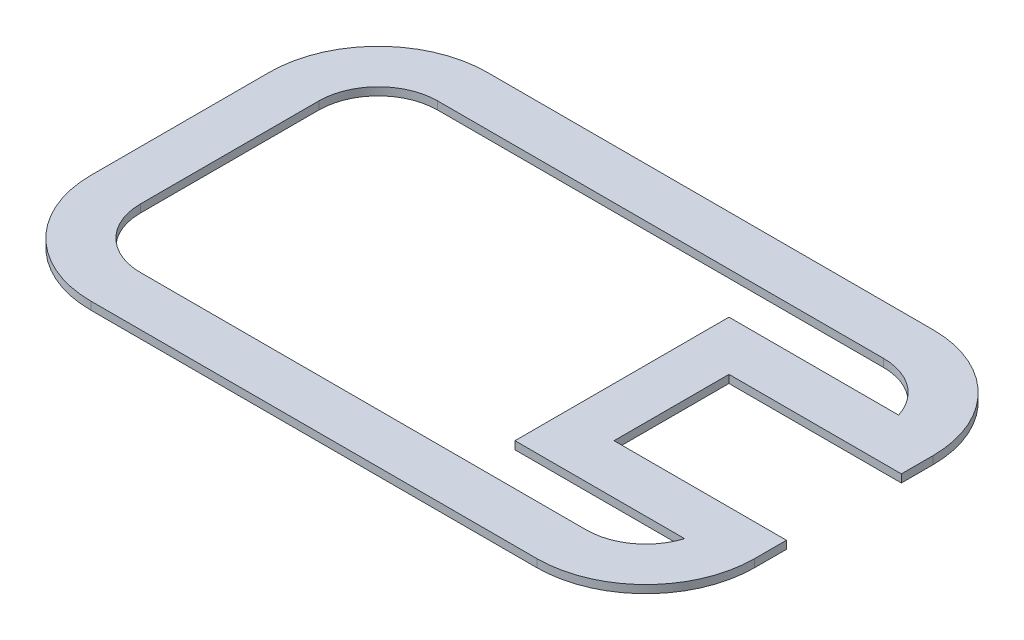
ISO-10303-21;
HEADER;
FILE_DESCRIPTION(('STEP AP214'),'2;1');
FILE_NAME('part.step','',(''),(''),'','','');
FILE_SCHEMA(('AUTOMOTIVE_DESIGN { 1 0 10303 214 1 1 1 1 }'));
ENDSEC;
DATA;
#1=APPLICATION_CONTEXT('core data for automotive mechanical design processes');
#2=APPLICATION_PROTOCOL_DEFINITION('international standard','automotive_design',2000,#1);
#3=PRODUCT_CONTEXT('',#1,'mechanical');
#4=PRODUCT('Part','Part','',(#3));
#5=PRODUCT_RELATED_PRODUCT_CATEGORY('part','',(#4));
#6=PRODUCT_DEFINITION_FORMATION('','',#4);
#7=PRODUCT_DEFINITION_CONTEXT('part definition',#1,'design');
#8=PRODUCT_DEFINITION('design','',#6,#7);
#9=PRODUCT_DEFINITION_SHAPE('','',#8);
#10=(LENGTH_UNIT() NAMED_UNIT(*) SI_UNIT(.MILLI.,.METRE.));
#11=(NAMED_UNIT(*) PLANE_ANGLE_UNIT() SI_UNIT($,.RADIAN.));
#12=(NAMED_UNIT(*) SI_UNIT($,.STERADIAN.) SOLID_ANGLE_UNIT());
#13=UNCERTAINTY_MEASURE_WITH_UNIT(LENGTH_MEASURE(1.E-05),#10,'distance_accuracy_value','');
#14=(GEOMETRIC_REPRESENTATION_CONTEXT(3) GLOBAL_UNCERTAINTY_ASSIGNED_CONTEXT((#13)) GLOBAL_UNIT_ASSIGNED_CONTEXT((#10,
#11,#12)) REPRESENTATION_CONTEXT('',''));
#15=CARTESIAN_POINT('',(0.,0.,0.));
#16=DIRECTION('',(0.,0.,1.));
#17=DIRECTION('',(1.,0.,0.));
#18=AXIS2_PLACEMENT_3D('',#15,#16,#17);
#19=CARTESIAN_POINT('',(55.,4.,-55.));
#20=DIRECTION('',(0.,-1.,0.));
#21=DIRECTION('',(0.,0.,-1.));
#22=AXIS2_PLACEMENT_3D('',#19,#20,#21);
#23=PLANE('',#22);
#24=CARTESIAN_POINT('',(55.,4.,-55.));
#25=DIRECTION('',(0.,1.,0.));
#26=DIRECTION('',(0.,0.,-1.));
#27=AXIS2_PLACEMENT_3D('',#24,#25,#26);
#28=CIRCLE('',#27,55.);
#29=CARTESIAN_POINT('',(0.,4.,-55.0000000000004));
#30=VERTEX_POINT('',#29);
#31=CARTESIAN_POINT('',(55.0000000000004,4.,0.));
#32=VERTEX_POINT('',#31);
#33=EDGE_CURVE('E262',#30,#32,#28,.T.);
#34=ORIENTED_EDGE('',*,*,#33,.T.);
#35=DIRECTION('',(1.,0.,0.));
#36=VECTOR('',#35,1.);
#37=CARTESIAN_POINT('',(55.0000000000004,4.,0.));
#38=LINE('',#37,#36);
#39=CARTESIAN_POINT('',(280.,4.,0.));
#40=VERTEX_POINT('',#39);
#41=EDGE_CURVE('E265',#32,#40,#38,.T.);
#42=ORIENTED_EDGE('',*,*,#41,.T.);
#43=CARTESIAN_POINT('',(280.,4.,-55.));
#44=DIRECTION('',(0.,1.,0.));
#45=DIRECTION('',(0.,0.,1.));
#46=AXIS2_PLACEMENT_3D('',#43,#44,#45);
#47=CIRCLE('',#46,55.);
#48=CARTESIAN_POINT('',(335.,4.,-55.0000000000004));
#49=VERTEX_POINT('',#48);
#50=EDGE_CURVE('E268',#40,#49,#47,.T.);
#51=ORIENTED_EDGE('',*,*,#50,.T.);
#52=DIRECTION('',(0.,0.,-1.));
#53=VECTOR('',#52,1.);
#54=CARTESIAN_POINT('',(335.,4.,-55.0000000000004));
#55=LINE('',#54,#53);
#56=CARTESIAN_POINT('',(335.,4.,-71.));
#57=VERTEX_POINT('',#56);
#58=EDGE_CURVE('E270',#49,#57,#55,.T.);
#59=ORIENTED_EDGE('',*,*,#58,.T.);
#60=DIRECTION('',(-1.,0.,0.));
#61=VECTOR('',#60,1.);
#62=CARTESIAN_POINT('',(248.,4.,-70.9999999999996));
#63=LINE('',#62,#61);
#64=CARTESIAN_POINT('',(248.,4.,-70.9999999999996));
#65=VERTEX_POINT('',#64);
#66=EDGE_CURVE('E272',#57,#65,#63,.T.);
#67=ORIENTED_EDGE('',*,*,#66,.T.);
#68=DIRECTION('',(0.,0.,-1.));
#69=VECTOR('',#68,1.);
#70=CARTESIAN_POINT('',(248.,4.,-129.));
#71=LINE('',#70,#69);
#72=CARTESIAN_POINT('',(248.,4.,-129.));
#73=VERTEX_POINT('',#72);
#74=EDGE_CURVE('E274',#65,#73,#71,.T.);
#75=ORIENTED_EDGE('',*,*,#74,.T.);
#76=DIRECTION('',(1.,0.,0.));
#77=VECTOR('',#76,1.);
#78=CARTESIAN_POINT('',(335.,4.,-129.));
#79=LINE('',#78,#77);
#80=CARTESIAN_POINT('',(335.,4.,-129.));
#81=VERTEX_POINT('',#80);
#82=EDGE_CURVE('E276',#73,#81,#79,.T.);
#83=ORIENTED_EDGE('',*,*,#82,.T.);
#84=DIRECTION('',(0.,0.,-1.));
#85=VECTOR('',#84,1.);
#86=CARTESIAN_POINT('',(335.,4.,-145.));
#87=LINE('',#86,#85);
#88=CARTESIAN_POINT('',(335.,4.,-145.));
#89=VERTEX_POINT('',#88);
#90=EDGE_CURVE('E278',#81,#89,#87,.T.);
#91=ORIENTED_EDGE('',*,*,#90,.T.);
#92=CARTESIAN_POINT('',(280.,4.,-145.));
#93=DIRECTION('',(0.,1.,0.));
#94=DIRECTION('',(0.,0.,-1.));
#95=AXIS2_PLACEMENT_3D('',#92,#93,#94);
#96=CIRCLE('',#95,55.);
#97=CARTESIAN_POINT('',(280.,4.,-200.));
#98=VERTEX_POINT('',#97);
#99=EDGE_CURVE('E280',#89,#98,#96,.T.);
#100=ORIENTED_EDGE('',*,*,#99,.T.);
#101=DIRECTION('',(-1.,0.,0.));
#102=VECTOR('',#101,1.);
#103=CARTESIAN_POINT('',(55.0000000000004,4.,-200.));
#104=LINE('',#103,#102);
#105=CARTESIAN_POINT('',(55.0000000000004,4.,-200.));
#106=VERTEX_POINT('',#105);
#107=EDGE_CURVE('E282',#98,#106,#104,.T.);
#108=ORIENTED_EDGE('',*,*,#107,.T.);
#109=CARTESIAN_POINT('',(55.,4.,-145.));
#110=DIRECTION('',(0.,1.,0.));
#111=DIRECTION('',(0.,0.,-1.));
#112=AXIS2_PLACEMENT_3D('',#109,#110,#111);
#113=CIRCLE('',#112,55.);
#114=CARTESIAN_POINT('',(0.,4.,-145.));
#115=VERTEX_POINT('',#114);
#116=EDGE_CURVE('E284',#106,#115,#113,.T.);
#117=ORIENTED_EDGE('',*,*,#116,.T.);
#118=DIRECTION('',(0.,0.,1.));
#119=VECTOR('',#118,1.);
#120=CARTESIAN_POINT('',(0.,4.,-55.0000000000004));
#121=LINE('',#120,#119);
#122=EDGE_CURVE('E286',#115,#30,#121,.T.);
#123=ORIENTED_EDGE('',*,*,#122,.T.);
#124=EDGE_LOOP('',(#34,#42,#51,#59,#67,#75,#83,#91,#100,#108,#117,#123));
#125=FACE_BOUND('',#124,.T.);
#126=CARTESIAN_POINT('',(55.,4.,-55.));
#127=DIRECTION('',(0.,1.,0.));
#128=DIRECTION('',(0.,0.,-1.));
#129=AXIS2_PLACEMENT_3D('',#126,#127,#128);
#130=CIRCLE('',#129,30.);
#131=CARTESIAN_POINT('',(25.,4.,-55.0000000000004));
#132=VERTEX_POINT('',#131);
#133=CARTESIAN_POINT('',(55.0000000000004,4.,-25.));
#134=VERTEX_POINT('',#133);
#135=EDGE_CURVE('E183',#132,#134,#130,.T.);
#136=ORIENTED_EDGE('',*,*,#135,.F.);
#137=DIRECTION('',(0.,0.,1.));
#138=VECTOR('',#137,1.);
#139=CARTESIAN_POINT('',(25.,4.,-55.0000000000004));
#140=LINE('',#139,#138);
#141=CARTESIAN_POINT('',(25.,4.,-145.));
#142=VERTEX_POINT('',#141);
#143=EDGE_CURVE('E220',#142,#132,#140,.T.);
#144=ORIENTED_EDGE('',*,*,#143,.F.);
#145=CARTESIAN_POINT('',(55.,4.,-145.));
#146=DIRECTION('',(0.,1.,0.));
#147=DIRECTION('',(0.,0.,-1.));
#148=AXIS2_PLACEMENT_3D('',#145,#146,#147);
#149=CIRCLE('',#148,30.);
#150=CARTESIAN_POINT('',(55.0000000000004,4.,-175.));
#151=VERTEX_POINT('',#150);
#152=EDGE_CURVE('E218',#151,#142,#149,.T.);
#153=ORIENTED_EDGE('',*,*,#152,.F.);
#154=DIRECTION('',(-1.,0.,0.));
#155=VECTOR('',#154,1.);
#156=CARTESIAN_POINT('',(55.0000000000004,4.,-175.));
#157=LINE('',#156,#155);
#158=CARTESIAN_POINT('',(280.,4.,-175.));
#159=VERTEX_POINT('',#158);
#160=EDGE_CURVE('E216',#159,#151,#157,.T.);
#161=ORIENTED_EDGE('',*,*,#160,.F.);
#162=CARTESIAN_POINT('',(280.,4.,-145.));
#163=DIRECTION('',(0.,1.,0.));
#164=DIRECTION('',(0.,0.,-1.));
#165=AXIS2_PLACEMENT_3D('',#162,#163,#164);
#166=CIRCLE('',#165,30.);
#167=CARTESIAN_POINT('',(308.618176042508,4.,-154.));
#168=VERTEX_POINT('',#167);
#169=EDGE_CURVE('E214',#168,#159,#166,.T.);
#170=ORIENTED_EDGE('',*,*,#169,.F.);
#171=DIRECTION('',(1.,0.,0.));
#172=VECTOR('',#171,1.);
#173=CARTESIAN_POINT('',(308.618176042508,4.,-154.));
#174=LINE('',#173,#172);
#175=CARTESIAN_POINT('',(223.,4.,-154.));
#176=VERTEX_POINT('',#175);
#177=EDGE_CURVE('E212',#176,#168,#174,.T.);
#178=ORIENTED_EDGE('',*,*,#177,.F.);
#179=DIRECTION('',(0.,0.,-1.));
#180=VECTOR('',#179,1.);
#181=CARTESIAN_POINT('',(223.,4.,-154.));
#182=LINE('',#181,#180);
#183=CARTESIAN_POINT('',(223.,4.,-45.9999999999996));
#184=VERTEX_POINT('',#183);
#185=EDGE_CURVE('E210',#184,#176,#182,.T.);
#186=ORIENTED_EDGE('',*,*,#185,.F.);
#187=DIRECTION('',(-1.,0.,0.));
#188=VECTOR('',#187,1.);
#189=CARTESIAN_POINT('',(223.,4.,-45.9999999999996));
#190=LINE('',#189,#188);
#191=CARTESIAN_POINT('',(308.618176042508,4.,-45.9999999999996));
#192=VERTEX_POINT('',#191);
#193=EDGE_CURVE('E206',#192,#184,#190,.T.);
#194=ORIENTED_EDGE('',*,*,#193,.F.);
#195=CARTESIAN_POINT('',(280.,4.,-55.));
#196=DIRECTION('',(0.,1.,0.));
#197=DIRECTION('',(0.,0.,1.));
#198=AXIS2_PLACEMENT_3D('',#195,#196,#197);
#199=CIRCLE('',#198,30.);
#200=CARTESIAN_POINT('',(280.,4.,-25.));
#201=VERTEX_POINT('',#200);
#202=EDGE_CURVE('E204',#201,#192,#199,.T.);
#203=ORIENTED_EDGE('',*,*,#202,.F.);
#204=DIRECTION('',(1.,0.,0.));
#205=VECTOR('',#204,1.);
#206=CARTESIAN_POINT('',(55.0000000000004,4.,-25.));
#207=LINE('',#206,#205);
#208=EDGE_CURVE('E191',#134,#201,#207,.T.);
#209=ORIENTED_EDGE('',*,*,#208,.F.);
#210=EDGE_LOOP('',(#136,#144,#153,#161,#170,#178,#186,#194,#203,#209));
#211=FACE_BOUND('',#210,.T.);
#212=ADVANCED_FACE('F34',(#125,#211),#23,.F.);
#213=CARTESIAN_POINT('',(55.,0.,-55.));
#214=DIRECTION('',(0.,-1.,0.));
#215=DIRECTION('',(0.,0.,-1.));
#216=AXIS2_PLACEMENT_3D('',#213,#214,#215);
#217=PLANE('',#216);
#218=CARTESIAN_POINT('',(55.,0.,-55.));
#219=DIRECTION('',(0.,1.,0.));
#220=DIRECTION('',(0.,0.,-1.));
#221=AXIS2_PLACEMENT_3D('',#218,#219,#220);
#222=CIRCLE('',#221,55.);
#223=CARTESIAN_POINT('',(0.,0.,-55.0000000000004));
#224=VERTEX_POINT('',#223);
#225=CARTESIAN_POINT('',(55.0000000000004,0.,0.));
#226=VERTEX_POINT('',#225);
#227=EDGE_CURVE('E199',#224,#226,#222,.T.);
#228=ORIENTED_EDGE('',*,*,#227,.F.);
#229=DIRECTION('',(0.,0.,1.));
#230=VECTOR('',#229,1.);
#231=CARTESIAN_POINT('',(0.,0.,-55.0000000000004));
#232=LINE('',#231,#230);
#233=CARTESIAN_POINT('',(0.,0.,-145.));
#234=VERTEX_POINT('',#233);
#235=EDGE_CURVE('E266',#234,#224,#232,.T.);
#236=ORIENTED_EDGE('',*,*,#235,.F.);
#237=CARTESIAN_POINT('',(55.,0.,-145.));
#238=DIRECTION('',(0.,1.,0.));
#239=DIRECTION('',(0.,0.,-1.));
#240=AXIS2_PLACEMENT_3D('',#237,#238,#239);
#241=CIRCLE('',#240,55.);
#242=CARTESIAN_POINT('',(55.0000000000004,0.,-200.));
#243=VERTEX_POINT('',#242);
#244=EDGE_CURVE('E309',#243,#234,#241,.T.);
#245=ORIENTED_EDGE('',*,*,#244,.F.);
#246=DIRECTION('',(-1.,0.,0.));
#247=VECTOR('',#246,1.);
#248=CARTESIAN_POINT('',(55.0000000000004,0.,-200.));
#249=LINE('',#248,#247);
#250=CARTESIAN_POINT('',(280.,0.,-200.));
#251=VERTEX_POINT('',#250);
#252=EDGE_CURVE('E307',#251,#243,#249,.T.);
#253=ORIENTED_EDGE('',*,*,#252,.F.);
#254=CARTESIAN_POINT('',(280.,0.,-145.));
#255=DIRECTION('',(0.,1.,0.));
#256=DIRECTION('',(0.,0.,-1.));
#257=AXIS2_PLACEMENT_3D('',#254,#255,#256);
#258=CIRCLE('',#257,55.);
#259=CARTESIAN_POINT('',(335.,0.,-145.));
#260=VERTEX_POINT('',#259);
#261=EDGE_CURVE('E305',#260,#251,#258,.T.);
#262=ORIENTED_EDGE('',*,*,#261,.F.);
#263=DIRECTION('',(0.,0.,-1.));
#264=VECTOR('',#263,1.);
#265=CARTESIAN_POINT('',(335.,0.,-145.));
#266=LINE('',#265,#264);
#267=CARTESIAN_POINT('',(335.,0.,-129.));
#268=VERTEX_POINT('',#267);
#269=EDGE_CURVE('E303',#268,#260,#266,.T.);
#270=ORIENTED_EDGE('',*,*,#269,.F.);
#271=DIRECTION('',(1.,0.,0.));
#272=VECTOR('',#271,1.);
#273=CARTESIAN_POINT('',(335.,0.,-129.));
#274=LINE('',#273,#272);
#275=CARTESIAN_POINT('',(248.,0.,-129.));
#276=VERTEX_POINT('',#275);
#277=EDGE_CURVE('E301',#276,#268,#274,.T.);
#278=ORIENTED_EDGE('',*,*,#277,.F.);
#279=DIRECTION('',(0.,0.,-1.));
#280=VECTOR('',#279,1.);
#281=CARTESIAN_POINT('',(248.,0.,-129.));
#282=LINE('',#281,#280);
#283=CARTESIAN_POINT('',(248.,0.,-70.9999999999996));
#284=VERTEX_POINT('',#283);
#285=EDGE_CURVE('E299',#284,#276,#282,.T.);
#286=ORIENTED_EDGE('',*,*,#285,.F.);
#287=DIRECTION('',(-1.,0.,0.));
#288=VECTOR('',#287,1.);
#289=CARTESIAN_POINT('',(248.,0.,-70.9999999999996));
#290=LINE('',#289,#288);
#291=CARTESIAN_POINT('',(335.,0.,-71.));
#292=VERTEX_POINT('',#291);
#293=EDGE_CURVE('E297',#292,#284,#290,.T.);
#294=ORIENTED_EDGE('',*,*,#293,.F.);
#295=DIRECTION('',(0.,0.,-1.));
#296=VECTOR('',#295,1.);
#297=CARTESIAN_POINT('',(335.,0.,-55.0000000000004));
#298=LINE('',#297,#296);
#299=CARTESIAN_POINT('',(335.,0.,-55.0000000000004));
#300=VERTEX_POINT('',#299);
#301=EDGE_CURVE('E295',#300,#292,#298,.T.);
#302=ORIENTED_EDGE('',*,*,#301,.F.);
#303=CARTESIAN_POINT('',(280.,0.,-55.));
#304=DIRECTION('',(0.,1.,0.));
#305=DIRECTION('',(0.,0.,1.));
#306=AXIS2_PLACEMENT_3D('',#303,#304,#305);
#307=CIRCLE('',#306,55.);
#308=CARTESIAN_POINT('',(280.,0.,0.));
#309=VERTEX_POINT('',#308);
#310=EDGE_CURVE('E293',#309,#300,#307,.T.);
#311=ORIENTED_EDGE('',*,*,#310,.F.);
#312=DIRECTION('',(1.,0.,0.));
#313=VECTOR('',#312,1.);
#314=CARTESIAN_POINT('',(55.0000000000004,0.,0.));
#315=LINE('',#314,#313);
#316=EDGE_CURVE('E291',#226,#309,#315,.T.);
#317=ORIENTED_EDGE('',*,*,#316,.F.);
#318=EDGE_LOOP('',(#228,#236,#245,#253,#262,#270,#278,#286,#294,#302,#311,#317));
#319=FACE_BOUND('',#318,.T.);
#320=DIRECTION('',(0.,0.,1.));
#321=VECTOR('',#320,1.);
#322=CARTESIAN_POINT('',(25.,0.,-55.0000000000004));
#323=LINE('',#322,#321);
#324=CARTESIAN_POINT('',(25.,0.,-145.));
#325=VERTEX_POINT('',#324);
#326=CARTESIAN_POINT('',(25.,0.,-55.0000000000004));
#327=VERTEX_POINT('',#326);
#328=EDGE_CURVE('E192',#325,#327,#323,.T.);
#329=ORIENTED_EDGE('',*,*,#328,.T.);
#330=CARTESIAN_POINT('',(55.,0.,-55.));
#331=DIRECTION('',(0.,1.,0.));
#332=DIRECTION('',(0.,0.,-1.));
#333=AXIS2_PLACEMENT_3D('',#330,#331,#332);
#334=CIRCLE('',#333,30.);
#335=CARTESIAN_POINT('',(55.0000000000004,0.,-25.));
#336=VERTEX_POINT('',#335);
#337=EDGE_CURVE('E57',#327,#336,#334,.T.);
#338=ORIENTED_EDGE('',*,*,#337,.T.);
#339=DIRECTION('',(1.,0.,0.));
#340=VECTOR('',#339,1.);
#341=CARTESIAN_POINT('',(55.0000000000004,0.,-25.));
#342=LINE('',#341,#340);
#343=CARTESIAN_POINT('',(280.,0.,-25.));
#344=VERTEX_POINT('',#343);
#345=EDGE_CURVE('E198',#336,#344,#342,.T.);
#346=ORIENTED_EDGE('',*,*,#345,.T.);
#347=CARTESIAN_POINT('',(280.,0.,-55.));
#348=DIRECTION('',(0.,1.,0.));
#349=DIRECTION('',(0.,0.,1.));
#350=AXIS2_PLACEMENT_3D('',#347,#348,#349);
#351=CIRCLE('',#350,30.);
#352=CARTESIAN_POINT('',(308.618176042508,0.,-45.9999999999996));
#353=VERTEX_POINT('',#352);
#354=EDGE_CURVE('E224',#344,#353,#351,.T.);
#355=ORIENTED_EDGE('',*,*,#354,.T.);
#356=DIRECTION('',(-1.,0.,0.));
#357=VECTOR('',#356,1.);
#358=CARTESIAN_POINT('',(223.,0.,-45.9999999999996));
#359=LINE('',#358,#357);
#360=CARTESIAN_POINT('',(223.,0.,-45.9999999999996));
#361=VERTEX_POINT('',#360);
#362=EDGE_CURVE('E227',#353,#361,#359,.T.);
#363=ORIENTED_EDGE('',*,*,#362,.T.);
#364=DIRECTION('',(0.,0.,-1.));
#365=VECTOR('',#364,1.);
#366=CARTESIAN_POINT('',(223.,0.,-154.));
#367=LINE('',#366,#365);
#368=CARTESIAN_POINT('',(223.,0.,-154.));
#369=VERTEX_POINT('',#368);
#370=EDGE_CURVE('E230',#361,#369,#367,.T.);
#371=ORIENTED_EDGE('',*,*,#370,.T.);
#372=DIRECTION('',(1.,0.,0.));
#373=VECTOR('',#372,1.);
#374=CARTESIAN_POINT('',(308.618176042508,0.,-154.));
#375=LINE('',#374,#373);
#376=CARTESIAN_POINT('',(308.618176042508,0.,-154.));
#377=VERTEX_POINT('',#376);
#378=EDGE_CURVE('E233',#369,#377,#375,.T.);
#379=ORIENTED_EDGE('',*,*,#378,.T.);
#380=CARTESIAN_POINT('',(280.,0.,-145.));
#381=DIRECTION('',(0.,1.,0.));
#382=DIRECTION('',(0.,0.,-1.));
#383=AXIS2_PLACEMENT_3D('',#380,#381,#382);
#384=CIRCLE('',#383,30.);
#385=CARTESIAN_POINT('',(280.,0.,-175.));
#386=VERTEX_POINT('',#385);
#387=EDGE_CURVE('E236',#377,#386,#384,.T.);
#388=ORIENTED_EDGE('',*,*,#387,.T.);
#389=DIRECTION('',(-1.,0.,0.));
#390=VECTOR('',#389,1.);
#391=CARTESIAN_POINT('',(55.0000000000004,0.,-175.));
#392=LINE('',#391,#390);
#393=CARTESIAN_POINT('',(55.0000000000004,0.,-175.));
#394=VERTEX_POINT('',#393);
#395=EDGE_CURVE('E239',#386,#394,#392,.T.);
#396=ORIENTED_EDGE('',*,*,#395,.T.);
#397=CARTESIAN_POINT('',(55.,0.,-145.));
#398=DIRECTION('',(0.,1.,0.));
#399=DIRECTION('',(0.,0.,-1.));
#400=AXIS2_PLACEMENT_3D('',#397,#398,#399);
#401=CIRCLE('',#400,30.);
#402=EDGE_CURVE('E242',#394,#325,#401,.T.);
#403=ORIENTED_EDGE('',*,*,#402,.T.);
#404=EDGE_LOOP('',(#329,#338,#346,#355,#363,#371,#379,#388,#396,#403));
#405=FACE_BOUND('',#404,.T.);
#406=ADVANCED_FACE('F351',(#319,#405),#217,.T.);
#407=CARTESIAN_POINT('',(55.,4.,-55.));
#408=DIRECTION('',(0.,-1.,0.));
#409=DIRECTION('',(0.,0.,-1.));
#410=AXIS2_PLACEMENT_3D('',#407,#408,#409);
#411=CYLINDRICAL_SURFACE('',#410,55.);
#412=ORIENTED_EDGE('',*,*,#227,.T.);
#413=DIRECTION('',(0.,-1.,0.));
#414=VECTOR('',#413,1.);
#415=CARTESIAN_POINT('',(55.0000000000004,4.,0.));
#416=LINE('',#415,#414);
#417=EDGE_CURVE('E11',#32,#226,#416,.T.);
#418=ORIENTED_EDGE('',*,*,#417,.F.);
#419=ORIENTED_EDGE('',*,*,#33,.F.);
#420=DIRECTION('',(0.,-1.,0.));
#421=VECTOR('',#420,1.);
#422=CARTESIAN_POINT('',(0.,4.,-55.0000000000004));
#423=LINE('',#422,#421);
#424=EDGE_CURVE('E288',#30,#224,#423,.T.);
#425=ORIENTED_EDGE('',*,*,#424,.T.);
#426=EDGE_LOOP('',(#412,#418,#419,#425));
#427=FACE_BOUND('',#426,.T.);
#428=ADVANCED_FACE('F36',(#427),#411,.T.);
#429=CARTESIAN_POINT('',(55.0000000000004,4.,0.));
#430=DIRECTION('',(0.,0.,-1.));
#431=DIRECTION('',(-1.,0.,0.));
#432=AXIS2_PLACEMENT_3D('',#429,#430,#431);
#433=PLANE('',#432);
#434=ORIENTED_EDGE('',*,*,#316,.T.);
#435=DIRECTION('',(0.,-1.,0.));
#436=VECTOR('',#435,1.);
#437=CARTESIAN_POINT('',(280.,4.,0.));
#438=LINE('',#437,#436);
#439=EDGE_CURVE('E42',#40,#309,#438,.T.);
#440=ORIENTED_EDGE('',*,*,#439,.F.);
#441=ORIENTED_EDGE('',*,*,#41,.F.);
#442=ORIENTED_EDGE('',*,*,#417,.T.);
#443=EDGE_LOOP('',(#434,#440,#441,#442));
#444=FACE_BOUND('',#443,.T.);
#445=ADVANCED_FACE('F368',(#444),#433,.F.);
#446=CARTESIAN_POINT('',(280.,4.,-55.));
#447=DIRECTION('',(0.,-1.,0.));
#448=DIRECTION('',(0.,0.,-1.));
#449=AXIS2_PLACEMENT_3D('',#446,#447,#448);
#450=CYLINDRICAL_SURFACE('',#449,55.);
#451=ORIENTED_EDGE('',*,*,#310,.T.);
#452=DIRECTION('',(0.,-1.,0.));
#453=VECTOR('',#452,1.);
#454=CARTESIAN_POINT('',(335.,4.,-55.0000000000004));
#455=LINE('',#454,#453);
#456=EDGE_CURVE('E338',#49,#300,#455,.T.);
#457=ORIENTED_EDGE('',*,*,#456,.F.);
#458=ORIENTED_EDGE('',*,*,#50,.F.);
#459=ORIENTED_EDGE('',*,*,#439,.T.);
#460=EDGE_LOOP('',(#451,#457,#458,#459));
#461=FACE_BOUND('',#460,.T.);
#462=ADVANCED_FACE('F345',(#461),#450,.T.);
#463=CARTESIAN_POINT('',(335.,4.,-55.0000000000004));
#464=DIRECTION('',(-1.,0.,0.));
#465=DIRECTION('',(0.,0.,1.));
#466=AXIS2_PLACEMENT_3D('',#463,#464,#465);
#467=PLANE('',#466);
#468=ORIENTED_EDGE('',*,*,#301,.T.);
#469=DIRECTION('',(0.,-1.,0.));
#470=VECTOR('',#469,1.);
#471=CARTESIAN_POINT('',(335.,4.,-71.));
#472=LINE('',#471,#470);
#473=EDGE_CURVE('E335',#57,#292,#472,.T.);
#474=ORIENTED_EDGE('',*,*,#473,.F.);
#475=ORIENTED_EDGE('',*,*,#58,.F.);
#476=ORIENTED_EDGE('',*,*,#456,.T.);
#477=EDGE_LOOP('',(#468,#474,#475,#476));
#478=FACE_BOUND('',#477,.T.);
#479=ADVANCED_FACE('F357',(#478),#467,.F.);
#480=CARTESIAN_POINT('',(248.,4.,-70.9999999999996));
#481=DIRECTION('',(0.,0.,1.));
#482=DIRECTION('',(1.,0.,0.));
#483=AXIS2_PLACEMENT_3D('',#480,#481,#482);
#484=PLANE('',#483);
#485=ORIENTED_EDGE('',*,*,#293,.T.);
#486=DIRECTION('',(0.,-1.,0.));
#487=VECTOR('',#486,1.);
#488=CARTESIAN_POINT('',(248.,4.,-70.9999999999996));
#489=LINE('',#488,#487);
#490=EDGE_CURVE('E332',#65,#284,#489,.T.);
#491=ORIENTED_EDGE('',*,*,#490,.F.);
#492=ORIENTED_EDGE('',*,*,#66,.F.);
#493=ORIENTED_EDGE('',*,*,#473,.T.);
#494=EDGE_LOOP('',(#485,#491,#492,#493));
#495=FACE_BOUND('',#494,.T.);
#496=ADVANCED_FACE('F361',(#495),#484,.F.);
#497=CARTESIAN_POINT('',(248.,4.,-129.));
#498=DIRECTION('',(-1.,0.,0.));
#499=DIRECTION('',(0.,0.,1.));
#500=AXIS2_PLACEMENT_3D('',#497,#498,#499);
#501=PLANE('',#500);
#502=ORIENTED_EDGE('',*,*,#285,.T.);
#503=DIRECTION('',(0.,-1.,0.));
#504=VECTOR('',#503,1.);
#505=CARTESIAN_POINT('',(248.,4.,-129.));
#506=LINE('',#505,#504);
#507=EDGE_CURVE('E329',#73,#276,#506,.T.);
#508=ORIENTED_EDGE('',*,*,#507,.F.);
#509=ORIENTED_EDGE('',*,*,#74,.F.);
#510=ORIENTED_EDGE('',*,*,#490,.T.);
#511=EDGE_LOOP('',(#502,#508,#509,#510));
#512=FACE_BOUND('',#511,.T.);
#513=ADVANCED_FACE('F401',(#512),#501,.F.);
#514=CARTESIAN_POINT('',(335.,4.,-129.));
#515=DIRECTION('',(0.,0.,-1.));
#516=DIRECTION('',(-1.,0.,0.));
#517=AXIS2_PLACEMENT_3D('',#514,#515,#516);
#518=PLANE('',#517);
#519=ORIENTED_EDGE('',*,*,#277,.T.);
#520=DIRECTION('',(0.,-1.,0.));
#521=VECTOR('',#520,1.);
#522=CARTESIAN_POINT('',(335.,4.,-129.));
#523=LINE('',#522,#521);
#524=EDGE_CURVE('E326',#81,#268,#523,.T.);
#525=ORIENTED_EDGE('',*,*,#524,.F.);
#526=ORIENTED_EDGE('',*,*,#82,.F.);
#527=ORIENTED_EDGE('',*,*,#507,.T.);
#528=EDGE_LOOP('',(#519,#525,#526,#527));
#529=FACE_BOUND('',#528,.T.);
#530=ADVANCED_FACE('F399',(#529),#518,.F.);
#531=CARTESIAN_POINT('',(335.,4.,-145.));
#532=DIRECTION('',(-1.,0.,0.));
#533=DIRECTION('',(0.,0.,1.));
#534=AXIS2_PLACEMENT_3D('',#531,#532,#533);
#535=PLANE('',#534);
#536=ORIENTED_EDGE('',*,*,#269,.T.);
#537=DIRECTION('',(0.,-1.,0.));
#538=VECTOR('',#537,1.);
#539=CARTESIAN_POINT('',(335.,4.,-145.));
#540=LINE('',#539,#538);
#541=EDGE_CURVE('E323',#89,#260,#540,.T.);
#542=ORIENTED_EDGE('',*,*,#541,.F.);
#543=ORIENTED_EDGE('',*,*,#90,.F.);
#544=ORIENTED_EDGE('',*,*,#524,.T.);
#545=EDGE_LOOP('',(#536,#542,#543,#544));
#546=FACE_BOUND('',#545,.T.);
#547=ADVANCED_FACE('F395',(#546),#535,.F.);
#548=CARTESIAN_POINT('',(280.,4.,-145.));
#549=DIRECTION('',(0.,-1.,0.));
#550=DIRECTION('',(0.,0.,-1.));
#551=AXIS2_PLACEMENT_3D('',#548,#549,#550);
#552=CYLINDRICAL_SURFACE('',#551,55.);
#553=ORIENTED_EDGE('',*,*,#261,.T.);
#554=DIRECTION('',(0.,-1.,0.));
#555=VECTOR('',#554,1.);
#556=CARTESIAN_POINT('',(280.,4.,-200.));
#557=LINE('',#556,#555);
#558=EDGE_CURVE('E320',#98,#251,#557,.T.);
#559=ORIENTED_EDGE('',*,*,#558,.F.);
#560=ORIENTED_EDGE('',*,*,#99,.F.);
#561=ORIENTED_EDGE('',*,*,#541,.T.);
#562=EDGE_LOOP('',(#553,#559,#560,#561));
#563=FACE_BOUND('',#562,.T.);
#564=ADVANCED_FACE('F390',(#563),#552,.T.);
#565=CARTESIAN_POINT('',(55.0000000000004,4.,-200.));
#566=DIRECTION('',(0.,0.,1.));
#567=DIRECTION('',(1.,0.,0.));
#568=AXIS2_PLACEMENT_3D('',#565,#566,#567);
#569=PLANE('',#568);
#570=ORIENTED_EDGE('',*,*,#252,.T.);
#571=DIRECTION('',(0.,-1.,0.));
#572=VECTOR('',#571,1.);
#573=CARTESIAN_POINT('',(55.0000000000004,4.,-200.));
#574=LINE('',#573,#572);
#575=EDGE_CURVE('E317',#106,#243,#574,.T.);
#576=ORIENTED_EDGE('',*,*,#575,.F.);
#577=ORIENTED_EDGE('',*,*,#107,.F.);
#578=ORIENTED_EDGE('',*,*,#558,.T.);
#579=EDGE_LOOP('',(#570,#576,#577,#578));
#580=FACE_BOUND('',#579,.T.);
#581=ADVANCED_FACE('F384',(#580),#569,.F.);
#582=CARTESIAN_POINT('',(55.,4.,-145.));
#583=DIRECTION('',(0.,-1.,0.));
#584=DIRECTION('',(0.,0.,-1.));
#585=AXIS2_PLACEMENT_3D('',#582,#583,#584);
#586=CYLINDRICAL_SURFACE('',#585,55.);
#587=ORIENTED_EDGE('',*,*,#244,.T.);
#588=DIRECTION('',(0.,-1.,0.));
#589=VECTOR('',#588,1.);
#590=CARTESIAN_POINT('',(0.,4.,-145.));
#591=LINE('',#590,#589);
#592=EDGE_CURVE('E314',#115,#234,#591,.T.);
#593=ORIENTED_EDGE('',*,*,#592,.F.);
#594=ORIENTED_EDGE('',*,*,#116,.F.);
#595=ORIENTED_EDGE('',*,*,#575,.T.);
#596=EDGE_LOOP('',(#587,#593,#594,#595));
#597=FACE_BOUND('',#596,.T.);
#598=ADVANCED_FACE('F380',(#597),#586,.T.);
#599=CARTESIAN_POINT('',(0.,4.,-55.0000000000004));
#600=DIRECTION('',(1.,0.,0.));
#601=DIRECTION('',(0.,0.,-1.));
#602=AXIS2_PLACEMENT_3D('',#599,#600,#601);
#603=PLANE('',#602);
#604=ORIENTED_EDGE('',*,*,#235,.T.);
#605=ORIENTED_EDGE('',*,*,#424,.F.);
#606=ORIENTED_EDGE('',*,*,#122,.F.);
#607=ORIENTED_EDGE('',*,*,#592,.T.);
#608=EDGE_LOOP('',(#604,#605,#606,#607));
#609=FACE_BOUND('',#608,.T.);
#610=ADVANCED_FACE('F375',(#609),#603,.F.);
#611=CARTESIAN_POINT('',(55.,4.,-55.));
#612=DIRECTION('',(0.,-1.,0.));
#613=DIRECTION('',(0.,0.,-1.));
#614=AXIS2_PLACEMENT_3D('',#611,#612,#613);
#615=CYLINDRICAL_SURFACE('',#614,30.);
#616=ORIENTED_EDGE('',*,*,#337,.F.);
#617=DIRECTION('',(0.,-1.,0.));
#618=VECTOR('',#617,1.);
#619=CARTESIAN_POINT('',(25.,4.,-55.0000000000004));
#620=LINE('',#619,#618);
#621=EDGE_CURVE('E187',#132,#327,#620,.T.);
#622=ORIENTED_EDGE('',*,*,#621,.F.);
#623=ORIENTED_EDGE('',*,*,#135,.T.);
#624=DIRECTION('',(0.,-1.,0.));
#625=VECTOR('',#624,1.);
#626=CARTESIAN_POINT('',(55.0000000000004,4.,-25.));
#627=LINE('',#626,#625);
#628=EDGE_CURVE('E186',#134,#336,#627,.T.);
#629=ORIENTED_EDGE('',*,*,#628,.T.);
#630=EDGE_LOOP('',(#616,#622,#623,#629));
#631=FACE_BOUND('',#630,.T.);
#632=ADVANCED_FACE('F185',(#631),#615,.F.);
#633=CARTESIAN_POINT('',(55.0000000000004,4.,-25.));
#634=DIRECTION('',(0.,0.,-1.));
#635=DIRECTION('',(-1.,0.,0.));
#636=AXIS2_PLACEMENT_3D('',#633,#634,#635);
#637=PLANE('',#636);
#638=ORIENTED_EDGE('',*,*,#345,.F.);
#639=ORIENTED_EDGE('',*,*,#628,.F.);
#640=ORIENTED_EDGE('',*,*,#208,.T.);
#641=DIRECTION('',(0.,-1.,0.));
#642=VECTOR('',#641,1.);
#643=CARTESIAN_POINT('',(280.,4.,-25.));
#644=LINE('',#643,#642);
#645=EDGE_CURVE('E200',#201,#344,#644,.T.);
#646=ORIENTED_EDGE('',*,*,#645,.T.);
#647=EDGE_LOOP('',(#638,#639,#640,#646));
#648=FACE_BOUND('',#647,.T.);
#649=ADVANCED_FACE('F195',(#648),#637,.T.);
#650=CARTESIAN_POINT('',(280.,4.,-55.));
#651=DIRECTION('',(0.,-1.,0.));
#652=DIRECTION('',(0.,0.,-1.));
#653=AXIS2_PLACEMENT_3D('',#650,#651,#652);
#654=CYLINDRICAL_SURFACE('',#653,30.);
#655=ORIENTED_EDGE('',*,*,#354,.F.);
#656=ORIENTED_EDGE('',*,*,#645,.F.);
#657=ORIENTED_EDGE('',*,*,#202,.T.);
#658=DIRECTION('',(0.,-1.,0.));
#659=VECTOR('',#658,1.);
#660=CARTESIAN_POINT('',(308.618176042508,4.,-45.9999999999996));
#661=LINE('',#660,#659);
#662=EDGE_CURVE('E259',#192,#353,#661,.T.);
#663=ORIENTED_EDGE('',*,*,#662,.T.);
#664=EDGE_LOOP('',(#655,#656,#657,#663));
#665=FACE_BOUND('',#664,.T.);
#666=ADVANCED_FACE('F459',(#665),#654,.F.);
#667=CARTESIAN_POINT('',(223.,4.,-45.9999999999996));
#668=DIRECTION('',(0.,0.,1.));
#669=DIRECTION('',(1.,0.,0.));
#670=AXIS2_PLACEMENT_3D('',#667,#668,#669);
#671=PLANE('',#670);
#672=ORIENTED_EDGE('',*,*,#362,.F.);
#673=ORIENTED_EDGE('',*,*,#662,.F.);
#674=ORIENTED_EDGE('',*,*,#193,.T.);
#675=DIRECTION('',(0.,-1.,0.));
#676=VECTOR('',#675,1.);
#677=CARTESIAN_POINT('',(223.,4.,-45.9999999999996));
#678=LINE('',#677,#676);
#679=EDGE_CURVE('E257',#184,#361,#678,.T.);
#680=ORIENTED_EDGE('',*,*,#679,.T.);
#681=EDGE_LOOP('',(#672,#673,#674,#680));
#682=FACE_BOUND('',#681,.T.);
#683=ADVANCED_FACE('F465',(#682),#671,.T.);
#684=CARTESIAN_POINT('',(223.,4.,-154.));
#685=DIRECTION('',(-1.,0.,0.));
#686=DIRECTION('',(0.,0.,1.));
#687=AXIS2_PLACEMENT_3D('',#684,#685,#686);
#688=PLANE('',#687);
#689=ORIENTED_EDGE('',*,*,#370,.F.);
#690=ORIENTED_EDGE('',*,*,#679,.F.);
#691=ORIENTED_EDGE('',*,*,#185,.T.);
#692=DIRECTION('',(0.,-1.,0.));
#693=VECTOR('',#692,1.);
#694=CARTESIAN_POINT('',(223.,4.,-154.));
#695=LINE('',#694,#693);
#696=EDGE_CURVE('E255',#176,#369,#695,.T.);
#697=ORIENTED_EDGE('',*,*,#696,.T.);
#698=EDGE_LOOP('',(#689,#690,#691,#697));
#699=FACE_BOUND('',#698,.T.);
#700=ADVANCED_FACE('F473',(#699),#688,.T.);
#701=CARTESIAN_POINT('',(308.618176042508,4.,-154.));
#702=DIRECTION('',(0.,0.,-1.));
#703=DIRECTION('',(-1.,0.,0.));
#704=AXIS2_PLACEMENT_3D('',#701,#702,#703);
#705=PLANE('',#704);
#706=ORIENTED_EDGE('',*,*,#378,.F.);
#707=ORIENTED_EDGE('',*,*,#696,.F.);
#708=ORIENTED_EDGE('',*,*,#177,.T.);
#709=DIRECTION('',(0.,-1.,0.));
#710=VECTOR('',#709,1.);
#711=CARTESIAN_POINT('',(308.618176042508,4.,-154.));
#712=LINE('',#711,#710);
#713=EDGE_CURVE('E253',#168,#377,#712,.T.);
#714=ORIENTED_EDGE('',*,*,#713,.T.);
#715=EDGE_LOOP('',(#706,#707,#708,#714));
#716=FACE_BOUND('',#715,.T.);
#717=ADVANCED_FACE('F481',(#716),#705,.T.);
#718=CARTESIAN_POINT('',(280.,4.,-145.));
#719=DIRECTION('',(0.,-1.,0.));
#720=DIRECTION('',(0.,0.,-1.));
#721=AXIS2_PLACEMENT_3D('',#718,#719,#720);
#722=CYLINDRICAL_SURFACE('',#721,30.);
#723=ORIENTED_EDGE('',*,*,#387,.F.);
#724=ORIENTED_EDGE('',*,*,#713,.F.);
#725=ORIENTED_EDGE('',*,*,#169,.T.);
#726=DIRECTION('',(0.,-1.,0.));
#727=VECTOR('',#726,1.);
#728=CARTESIAN_POINT('',(280.,4.,-175.));
#729=LINE('',#728,#727);
#730=EDGE_CURVE('E251',#159,#386,#729,.T.);
#731=ORIENTED_EDGE('',*,*,#730,.T.);
#732=EDGE_LOOP('',(#723,#724,#725,#731));
#733=FACE_BOUND('',#732,.T.);
#734=ADVANCED_FACE('F489',(#733),#722,.F.);
#735=CARTESIAN_POINT('',(55.0000000000004,4.,-175.));
#736=DIRECTION('',(0.,0.,1.));
#737=DIRECTION('',(1.,0.,0.));
#738=AXIS2_PLACEMENT_3D('',#735,#736,#737);
#739=PLANE('',#738);
#740=ORIENTED_EDGE('',*,*,#395,.F.);
#741=ORIENTED_EDGE('',*,*,#730,.F.);
#742=ORIENTED_EDGE('',*,*,#160,.T.);
#743=DIRECTION('',(0.,-1.,0.));
#744=VECTOR('',#743,1.);
#745=CARTESIAN_POINT('',(55.0000000000004,4.,-175.));
#746=LINE('',#745,#744);
#747=EDGE_CURVE('E249',#151,#394,#746,.T.);
#748=ORIENTED_EDGE('',*,*,#747,.T.);
#749=EDGE_LOOP('',(#740,#741,#742,#748));
#750=FACE_BOUND('',#749,.T.);
#751=ADVANCED_FACE('F497',(#750),#739,.T.);
#752=CARTESIAN_POINT('',(55.,4.,-145.));
#753=DIRECTION('',(0.,-1.,0.));
#754=DIRECTION('',(0.,0.,-1.));
#755=AXIS2_PLACEMENT_3D('',#752,#753,#754);
#756=CYLINDRICAL_SURFACE('',#755,30.);
#757=ORIENTED_EDGE('',*,*,#402,.F.);
#758=ORIENTED_EDGE('',*,*,#747,.F.);
#759=ORIENTED_EDGE('',*,*,#152,.T.);
#760=DIRECTION('',(0.,-1.,0.));
#761=VECTOR('',#760,1.);
#762=CARTESIAN_POINT('',(25.,4.,-145.));
#763=LINE('',#762,#761);
#764=EDGE_CURVE('E49',#142,#325,#763,.T.);
#765=ORIENTED_EDGE('',*,*,#764,.T.);
#766=EDGE_LOOP('',(#757,#758,#759,#765));
#767=FACE_BOUND('',#766,.T.);
#768=ADVANCED_FACE('F505',(#767),#756,.F.);
#769=CARTESIAN_POINT('',(25.,4.,-55.0000000000004));
#770=DIRECTION('',(1.,0.,0.));
#771=DIRECTION('',(0.,0.,-1.));
#772=AXIS2_PLACEMENT_3D('',#769,#770,#771);
#773=PLANE('',#772);
#774=ORIENTED_EDGE('',*,*,#328,.F.);
#775=ORIENTED_EDGE('',*,*,#764,.F.);
#776=ORIENTED_EDGE('',*,*,#143,.T.);
#777=ORIENTED_EDGE('',*,*,#621,.T.);
#778=EDGE_LOOP('',(#774,#775,#776,#777));
#779=FACE_BOUND('',#778,.T.);
#780=ADVANCED_FACE('F513',(#779),#773,.T.);
#781=CLOSED_SHELL('',(#212,#406,#428,#445,#462,#479,#496,#513,#530,#547,#564,#581,#598,#610,
#632,#649,#666,#683,#700,#717,#734,#751,#768,#780));
#782=MANIFOLD_SOLID_BREP('B2',#781);
#783=ADVANCED_BREP_SHAPE_REPRESENTATION('',(#18,#782),#14);
#784=SHAPE_DEFINITION_REPRESENTATION(#9,#783);
ENDSEC;
END-ISO-10303-21;
